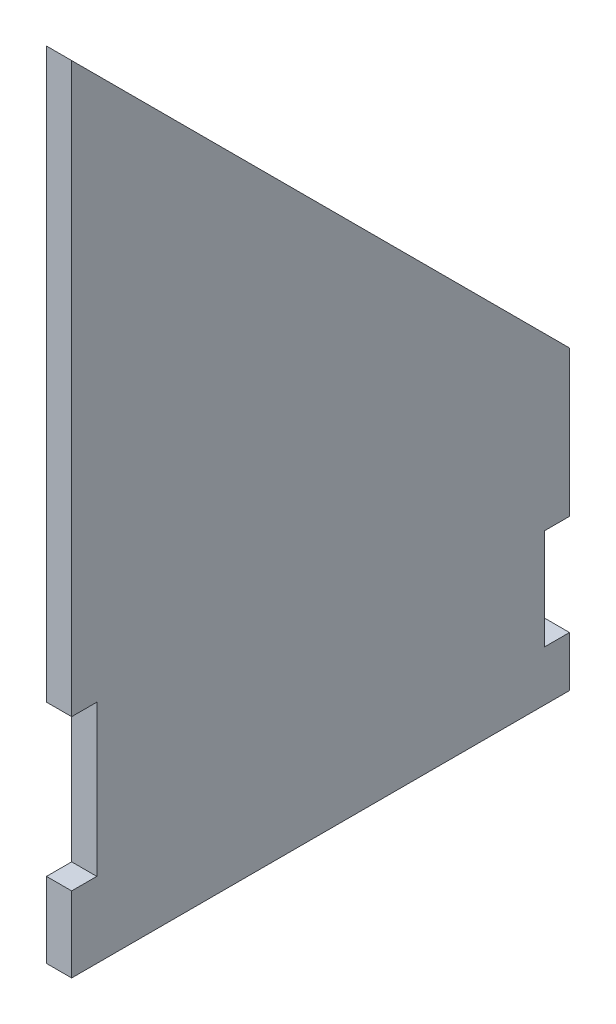
ISO-10303-21;
HEADER;
FILE_DESCRIPTION(('STEP AP214'),'2;1');
FILE_NAME('part.step','',(''),(''),'','','');
FILE_SCHEMA(('AUTOMOTIVE_DESIGN { 1 0 10303 214 1 1 1 1 }'));
ENDSEC;
DATA;
#1=APPLICATION_CONTEXT('core data for automotive mechanical design processes');
#2=APPLICATION_PROTOCOL_DEFINITION('international standard','automotive_design',2000,#1);
#3=PRODUCT_CONTEXT('',#1,'mechanical');
#4=PRODUCT('Part','Part','',(#3));
#5=PRODUCT_RELATED_PRODUCT_CATEGORY('part','',(#4));
#6=PRODUCT_DEFINITION_FORMATION('','',#4);
#7=PRODUCT_DEFINITION_CONTEXT('part definition',#1,'design');
#8=PRODUCT_DEFINITION('design','',#6,#7);
#9=PRODUCT_DEFINITION_SHAPE('','',#8);
#10=(LENGTH_UNIT() NAMED_UNIT(*) SI_UNIT(.MILLI.,.METRE.));
#11=(NAMED_UNIT(*) PLANE_ANGLE_UNIT() SI_UNIT($,.RADIAN.));
#12=(NAMED_UNIT(*) SI_UNIT($,.STERADIAN.) SOLID_ANGLE_UNIT());
#13=UNCERTAINTY_MEASURE_WITH_UNIT(LENGTH_MEASURE(1.E-05),#10,'distance_accuracy_value','');
#14=(GEOMETRIC_REPRESENTATION_CONTEXT(3) GLOBAL_UNCERTAINTY_ASSIGNED_CONTEXT((#13)) GLOBAL_UNIT_ASSIGNED_CONTEXT((#10,
#11,#12)) REPRESENTATION_CONTEXT('',''));
#15=CARTESIAN_POINT('',(0.,0.,0.));
#16=DIRECTION('',(0.,0.,1.));
#17=DIRECTION('',(1.,0.,0.));
#18=AXIS2_PLACEMENT_3D('',#15,#16,#17);
#19=CARTESIAN_POINT('',(5.,0.,-98.9949493661161));
#20=DIRECTION('',(0.,0.,1.));
#21=DIRECTION('',(0.,-1.,0.));
#22=AXIS2_PLACEMENT_3D('',#19,#20,#21);
#23=PLANE('',#22);
#24=DIRECTION('',(0.,1.,0.));
#25=VECTOR('',#24,1.);
#26=CARTESIAN_POINT('',(5.,0.,-98.9949493661161));
#27=LINE('',#26,#25);
#28=CARTESIAN_POINT('',(5.,30.,-98.9949493661161));
#29=VERTEX_POINT('',#28);
#30=CARTESIAN_POINT('',(5.,59.,-98.9949493661161));
#31=VERTEX_POINT('',#30);
#32=EDGE_CURVE('E171',#29,#31,#27,.T.);
#33=ORIENTED_EDGE('',*,*,#32,.F.);
#34=DIRECTION('',(1.,0.,0.));
#35=VECTOR('',#34,1.);
#36=CARTESIAN_POINT('',(-5.,30.,-98.9949493661161));
#37=LINE('',#36,#35);
#38=CARTESIAN_POINT('',(0.,30.,-98.9949493661161));
#39=VERTEX_POINT('',#38);
#40=EDGE_CURVE('E147',#39,#29,#37,.T.);
#41=ORIENTED_EDGE('',*,*,#40,.F.);
#42=DIRECTION('',(0.,1.,0.));
#43=VECTOR('',#42,1.);
#44=CARTESIAN_POINT('',(0.,0.,-98.9949493661161));
#45=LINE('',#44,#43);
#46=CARTESIAN_POINT('',(0.,59.,-98.9949493661161));
#47=VERTEX_POINT('',#46);
#48=EDGE_CURVE('E181',#39,#47,#45,.T.);
#49=ORIENTED_EDGE('',*,*,#48,.T.);
#50=DIRECTION('',(-1.,0.,0.));
#51=VECTOR('',#50,1.);
#52=CARTESIAN_POINT('',(5.,59.,-98.9949493661161));
#53=LINE('',#52,#51);
#54=EDGE_CURVE('E189',#31,#47,#53,.T.);
#55=ORIENTED_EDGE('',*,*,#54,.F.);
#56=EDGE_LOOP('',(#33,#41,#49,#55));
#57=FACE_BOUND('',#56,.T.);
#58=ADVANCED_FACE('F33',(#57),#23,.F.);
#59=CARTESIAN_POINT('',(5.,0.,0.));
#60=DIRECTION('',(0.,0.,-1.));
#61=DIRECTION('',(0.,1.,0.));
#62=AXIS2_PLACEMENT_3D('',#59,#60,#61);
#63=PLANE('',#62);
#64=DIRECTION('',(0.,-1.,0.));
#65=VECTOR('',#64,1.);
#66=CARTESIAN_POINT('',(5.,0.,0.));
#67=LINE('',#66,#65);
#68=CARTESIAN_POINT('',(5.,15.,0.));
#69=VERTEX_POINT('',#68);
#70=CARTESIAN_POINT('',(5.,0.,0.));
#71=VERTEX_POINT('',#70);
#72=EDGE_CURVE('E169',#69,#71,#67,.T.);
#73=ORIENTED_EDGE('',*,*,#72,.F.);
#74=DIRECTION('',(1.,0.,0.));
#75=VECTOR('',#74,1.);
#76=CARTESIAN_POINT('',(-5.,15.,0.));
#77=LINE('',#76,#75);
#78=CARTESIAN_POINT('',(0.,15.,0.));
#79=VERTEX_POINT('',#78);
#80=EDGE_CURVE('E161',#79,#69,#77,.T.);
#81=ORIENTED_EDGE('',*,*,#80,.F.);
#82=DIRECTION('',(0.,-1.,0.));
#83=VECTOR('',#82,1.);
#84=CARTESIAN_POINT('',(0.,0.,0.));
#85=LINE('',#84,#83);
#86=CARTESIAN_POINT('',(0.,0.,0.));
#87=VERTEX_POINT('',#86);
#88=EDGE_CURVE('E160',#79,#87,#85,.T.);
#89=ORIENTED_EDGE('',*,*,#88,.T.);
#90=DIRECTION('',(-1.,0.,0.));
#91=VECTOR('',#90,1.);
#92=CARTESIAN_POINT('',(5.,0.,0.));
#93=LINE('',#92,#91);
#94=EDGE_CURVE('E195',#71,#87,#93,.T.);
#95=ORIENTED_EDGE('',*,*,#94,.F.);
#96=EDGE_LOOP('',(#73,#81,#89,#95));
#97=FACE_BOUND('',#96,.T.);
#98=ADVANCED_FACE('F238',(#97),#63,.F.);
#99=CARTESIAN_POINT('',(0.,157.994949366118,0.));
#100=VERTEX_POINT('',#99);
#101=CARTESIAN_POINT('',(0.,45.,0.));
#102=VERTEX_POINT('',#101);
#103=EDGE_CURVE('E176',#100,#102,#85,.T.);
#104=ORIENTED_EDGE('',*,*,#103,.T.);
#105=DIRECTION('',(1.,0.,0.));
#106=VECTOR('',#105,1.);
#107=CARTESIAN_POINT('',(-5.,45.,0.));
#108=LINE('',#107,#106);
#109=CARTESIAN_POINT('',(5.,45.,0.));
#110=VERTEX_POINT('',#109);
#111=EDGE_CURVE('E56',#102,#110,#108,.T.);
#112=ORIENTED_EDGE('',*,*,#111,.T.);
#113=CARTESIAN_POINT('',(5.,157.994949366118,0.));
#114=VERTEX_POINT('',#113);
#115=EDGE_CURVE('E165',#114,#110,#67,.T.);
#116=ORIENTED_EDGE('',*,*,#115,.F.);
#117=DIRECTION('',(-1.,0.,0.));
#118=VECTOR('',#117,1.);
#119=CARTESIAN_POINT('',(5.,157.994949366118,0.));
#120=LINE('',#119,#118);
#121=EDGE_CURVE('E175',#114,#100,#120,.T.);
#122=ORIENTED_EDGE('',*,*,#121,.T.);
#123=EDGE_LOOP('',(#104,#112,#116,#122));
#124=FACE_BOUND('',#123,.T.);
#125=ADVANCED_FACE('F35',(#124),#63,.F.);
#126=CARTESIAN_POINT('',(5.,0.,0.));
#127=DIRECTION('',(0.,1.,0.));
#128=DIRECTION('',(0.,0.,1.));
#129=AXIS2_PLACEMENT_3D('',#126,#127,#128);
#130=PLANE('',#129);
#131=DIRECTION('',(0.,0.,-1.));
#132=VECTOR('',#131,1.);
#133=CARTESIAN_POINT('',(0.,0.,0.));
#134=LINE('',#133,#132);
#135=CARTESIAN_POINT('',(0.,0.,-98.9949493661161));
#136=VERTEX_POINT('',#135);
#137=EDGE_CURVE('E179',#87,#136,#134,.T.);
#138=ORIENTED_EDGE('',*,*,#137,.T.);
#139=DIRECTION('',(-1.,0.,0.));
#140=VECTOR('',#139,1.);
#141=CARTESIAN_POINT('',(5.,0.,-98.9949493661161));
#142=LINE('',#141,#140);
#143=CARTESIAN_POINT('',(5.,0.,-98.9949493661161));
#144=VERTEX_POINT('',#143);
#145=EDGE_CURVE('E192',#144,#136,#142,.T.);
#146=ORIENTED_EDGE('',*,*,#145,.F.);
#147=DIRECTION('',(0.,0.,-1.));
#148=VECTOR('',#147,1.);
#149=CARTESIAN_POINT('',(5.,0.,0.));
#150=LINE('',#149,#148);
#151=EDGE_CURVE('E168',#71,#144,#150,.T.);
#152=ORIENTED_EDGE('',*,*,#151,.F.);
#153=ORIENTED_EDGE('',*,*,#94,.T.);
#154=EDGE_LOOP('',(#138,#146,#152,#153));
#155=FACE_BOUND('',#154,.T.);
#156=ADVANCED_FACE('F242',(#155),#130,.F.);
#157=CARTESIAN_POINT('',(0.,10.,-98.9949493661161));
#158=VERTEX_POINT('',#157);
#159=EDGE_CURVE('E182',#136,#158,#45,.T.);
#160=ORIENTED_EDGE('',*,*,#159,.T.);
#161=DIRECTION('',(1.,0.,0.));
#162=VECTOR('',#161,1.);
#163=CARTESIAN_POINT('',(-5.,10.,-98.9949493661161));
#164=LINE('',#163,#162);
#165=CARTESIAN_POINT('',(5.,10.,-98.9949493661161));
#166=VERTEX_POINT('',#165);
#167=EDGE_CURVE('E48',#158,#166,#164,.T.);
#168=ORIENTED_EDGE('',*,*,#167,.T.);
#169=EDGE_CURVE('E141',#144,#166,#27,.T.);
#170=ORIENTED_EDGE('',*,*,#169,.F.);
#171=ORIENTED_EDGE('',*,*,#145,.T.);
#172=EDGE_LOOP('',(#160,#168,#170,#171));
#173=FACE_BOUND('',#172,.T.);
#174=ADVANCED_FACE('F246',(#173),#23,.F.);
#175=CARTESIAN_POINT('',(5.,157.994949366118,0.));
#176=DIRECTION('',(0.,-0.707106781186542,0.707106781186553));
#177=DIRECTION('',(0.,-0.707106781186553,-0.707106781186542));
#178=AXIS2_PLACEMENT_3D('',#175,#176,#177);
#179=PLANE('',#178);
#180=DIRECTION('',(0.,0.707106781186553,0.707106781186542));
#181=VECTOR('',#180,1.);
#182=CARTESIAN_POINT('',(0.,157.994949366118,0.));
#183=LINE('',#182,#181);
#184=EDGE_CURVE('E185',#47,#100,#183,.T.);
#185=ORIENTED_EDGE('',*,*,#184,.T.);
#186=ORIENTED_EDGE('',*,*,#121,.F.);
#187=DIRECTION('',(0.,0.707106781186553,0.707106781186542));
#188=VECTOR('',#187,1.);
#189=CARTESIAN_POINT('',(5.,157.994949366118,0.));
#190=LINE('',#189,#188);
#191=EDGE_CURVE('E173',#31,#114,#190,.T.);
#192=ORIENTED_EDGE('',*,*,#191,.F.);
#193=ORIENTED_EDGE('',*,*,#54,.T.);
#194=EDGE_LOOP('',(#185,#186,#192,#193));
#195=FACE_BOUND('',#194,.T.);
#196=ADVANCED_FACE('F218',(#195),#179,.F.);
#197=CARTESIAN_POINT('',(5.,0.,0.));
#198=DIRECTION('',(-1.,0.,0.));
#199=DIRECTION('',(0.,0.,1.));
#200=AXIS2_PLACEMENT_3D('',#197,#198,#199);
#201=PLANE('',#200);
#202=DIRECTION('',(0.,-1.,0.));
#203=VECTOR('',#202,1.);
#204=CARTESIAN_POINT('',(5.,30.,-93.9949493661161));
#205=LINE('',#204,#203);
#206=CARTESIAN_POINT('',(5.,30.,-93.9949493661161));
#207=VERTEX_POINT('',#206);
#208=CARTESIAN_POINT('',(5.,10.,-93.9949493661161));
#209=VERTEX_POINT('',#208);
#210=EDGE_CURVE('E130',#207,#209,#205,.T.);
#211=ORIENTED_EDGE('',*,*,#210,.F.);
#212=DIRECTION('',(0.,0.,1.));
#213=VECTOR('',#212,1.);
#214=CARTESIAN_POINT('',(5.,30.,-93.9949493661161));
#215=LINE('',#214,#213);
#216=EDGE_CURVE('E127',#29,#207,#215,.T.);
#217=ORIENTED_EDGE('',*,*,#216,.F.);
#218=ORIENTED_EDGE('',*,*,#32,.T.);
#219=ORIENTED_EDGE('',*,*,#191,.T.);
#220=ORIENTED_EDGE('',*,*,#115,.T.);
#221=DIRECTION('',(0.,0.,1.));
#222=VECTOR('',#221,1.);
#223=CARTESIAN_POINT('',(5.,45.,-5.00000000000001));
#224=LINE('',#223,#222);
#225=CARTESIAN_POINT('',(5.,45.,-5.00000000000001));
#226=VERTEX_POINT('',#225);
#227=EDGE_CURVE('E152',#226,#110,#224,.T.);
#228=ORIENTED_EDGE('',*,*,#227,.F.);
#229=DIRECTION('',(0.,1.,0.));
#230=VECTOR('',#229,1.);
#231=CARTESIAN_POINT('',(5.,45.,-5.00000000000001));
#232=LINE('',#231,#230);
#233=CARTESIAN_POINT('',(5.,15.,-5.00000000000001));
#234=VERTEX_POINT('',#233);
#235=EDGE_CURVE('E146',#234,#226,#232,.T.);
#236=ORIENTED_EDGE('',*,*,#235,.F.);
#237=DIRECTION('',(0.,0.,-1.));
#238=VECTOR('',#237,1.);
#239=CARTESIAN_POINT('',(5.,15.,-5.00000000000001));
#240=LINE('',#239,#238);
#241=EDGE_CURVE('E154',#69,#234,#240,.T.);
#242=ORIENTED_EDGE('',*,*,#241,.F.);
#243=ORIENTED_EDGE('',*,*,#72,.T.);
#244=ORIENTED_EDGE('',*,*,#151,.T.);
#245=ORIENTED_EDGE('',*,*,#169,.T.);
#246=DIRECTION('',(0.,0.,-1.));
#247=VECTOR('',#246,1.);
#248=CARTESIAN_POINT('',(5.,10.,-93.9949493661161));
#249=LINE('',#248,#247);
#250=EDGE_CURVE('E123',#209,#166,#249,.T.);
#251=ORIENTED_EDGE('',*,*,#250,.F.);
#252=EDGE_LOOP('',(#211,#217,#218,#219,#220,#228,#236,#242,#243,#244,#245,#251));
#253=FACE_BOUND('',#252,.T.);
#254=ADVANCED_FACE('F139',(#253),#201,.F.);
#255=CARTESIAN_POINT('',(0.,0.,0.));
#256=DIRECTION('',(-1.,0.,0.));
#257=DIRECTION('',(0.,0.,1.));
#258=AXIS2_PLACEMENT_3D('',#255,#256,#257);
#259=PLANE('',#258);
#260=DIRECTION('',(0.,0.,-1.));
#261=VECTOR('',#260,1.);
#262=CARTESIAN_POINT('',(0.,30.,0.));
#263=LINE('',#262,#261);
#264=CARTESIAN_POINT('',(0.,30.,-93.9949493661161));
#265=VERTEX_POINT('',#264);
#266=EDGE_CURVE('E11',#265,#39,#263,.T.);
#267=ORIENTED_EDGE('',*,*,#266,.F.);
#268=DIRECTION('',(0.,1.,0.));
#269=VECTOR('',#268,1.);
#270=CARTESIAN_POINT('',(0.,0.,-93.9949493661161));
#271=LINE('',#270,#269);
#272=CARTESIAN_POINT('',(0.,10.,-93.9949493661161));
#273=VERTEX_POINT('',#272);
#274=EDGE_CURVE('E41',#273,#265,#271,.T.);
#275=ORIENTED_EDGE('',*,*,#274,.F.);
#276=DIRECTION('',(0.,0.,1.));
#277=VECTOR('',#276,1.);
#278=CARTESIAN_POINT('',(0.,10.,0.));
#279=LINE('',#278,#277);
#280=EDGE_CURVE('E124',#158,#273,#279,.T.);
#281=ORIENTED_EDGE('',*,*,#280,.F.);
#282=ORIENTED_EDGE('',*,*,#159,.F.);
#283=ORIENTED_EDGE('',*,*,#137,.F.);
#284=ORIENTED_EDGE('',*,*,#88,.F.);
#285=DIRECTION('',(0.,0.,1.));
#286=VECTOR('',#285,1.);
#287=CARTESIAN_POINT('',(0.,15.,0.));
#288=LINE('',#287,#286);
#289=CARTESIAN_POINT('',(0.,15.,-5.00000000000001));
#290=VERTEX_POINT('',#289);
#291=EDGE_CURVE('E202',#290,#79,#288,.T.);
#292=ORIENTED_EDGE('',*,*,#291,.F.);
#293=DIRECTION('',(0.,-1.,0.));
#294=VECTOR('',#293,1.);
#295=CARTESIAN_POINT('',(0.,0.,-5.00000000000001));
#296=LINE('',#295,#294);
#297=CARTESIAN_POINT('',(0.,45.,-5.00000000000001));
#298=VERTEX_POINT('',#297);
#299=EDGE_CURVE('E200',#298,#290,#296,.T.);
#300=ORIENTED_EDGE('',*,*,#299,.F.);
#301=DIRECTION('',(0.,0.,-1.));
#302=VECTOR('',#301,1.);
#303=CARTESIAN_POINT('',(0.,45.,0.));
#304=LINE('',#303,#302);
#305=EDGE_CURVE('E198',#102,#298,#304,.T.);
#306=ORIENTED_EDGE('',*,*,#305,.F.);
#307=ORIENTED_EDGE('',*,*,#103,.F.);
#308=ORIENTED_EDGE('',*,*,#184,.F.);
#309=ORIENTED_EDGE('',*,*,#48,.F.);
#310=EDGE_LOOP('',(#267,#275,#281,#282,#283,#284,#292,#300,#306,#307,#308,#309));
#311=FACE_BOUND('',#310,.T.);
#312=ADVANCED_FACE('F210',(#311),#259,.T.);
#313=CARTESIAN_POINT('',(-5.,45.,-5.00000000000001));
#314=DIRECTION('',(0.,0.,-1.));
#315=DIRECTION('',(0.,1.,0.));
#316=AXIS2_PLACEMENT_3D('',#313,#314,#315);
#317=PLANE('',#316);
#318=ORIENTED_EDGE('',*,*,#299,.T.);
#319=DIRECTION('',(1.,0.,0.));
#320=VECTOR('',#319,1.);
#321=CARTESIAN_POINT('',(-5.,15.,-5.00000000000001));
#322=LINE('',#321,#320);
#323=EDGE_CURVE('E158',#290,#234,#322,.T.);
#324=ORIENTED_EDGE('',*,*,#323,.T.);
#325=ORIENTED_EDGE('',*,*,#235,.T.);
#326=DIRECTION('',(1.,0.,0.));
#327=VECTOR('',#326,1.);
#328=CARTESIAN_POINT('',(-5.,45.,-5.00000000000001));
#329=LINE('',#328,#327);
#330=EDGE_CURVE('E157',#298,#226,#329,.T.);
#331=ORIENTED_EDGE('',*,*,#330,.F.);
#332=EDGE_LOOP('',(#318,#324,#325,#331));
#333=FACE_BOUND('',#332,.T.);
#334=ADVANCED_FACE('F229',(#333),#317,.F.);
#335=CARTESIAN_POINT('',(-5.,15.,-5.00000000000001));
#336=DIRECTION('',(0.,-1.,0.));
#337=DIRECTION('',(0.,0.,-1.));
#338=AXIS2_PLACEMENT_3D('',#335,#336,#337);
#339=PLANE('',#338);
#340=ORIENTED_EDGE('',*,*,#291,.T.);
#341=ORIENTED_EDGE('',*,*,#80,.T.);
#342=ORIENTED_EDGE('',*,*,#241,.T.);
#343=ORIENTED_EDGE('',*,*,#323,.F.);
#344=EDGE_LOOP('',(#340,#341,#342,#343));
#345=FACE_BOUND('',#344,.T.);
#346=ADVANCED_FACE('F247',(#345),#339,.F.);
#347=CARTESIAN_POINT('',(-5.,45.,-5.00000000000001));
#348=DIRECTION('',(0.,1.,0.));
#349=DIRECTION('',(0.,0.,1.));
#350=AXIS2_PLACEMENT_3D('',#347,#348,#349);
#351=PLANE('',#350);
#352=ORIENTED_EDGE('',*,*,#305,.T.);
#353=ORIENTED_EDGE('',*,*,#330,.T.);
#354=ORIENTED_EDGE('',*,*,#227,.T.);
#355=ORIENTED_EDGE('',*,*,#111,.F.);
#356=EDGE_LOOP('',(#352,#353,#354,#355));
#357=FACE_BOUND('',#356,.T.);
#358=ADVANCED_FACE('F227',(#357),#351,.F.);
#359=CARTESIAN_POINT('',(-5.,30.,-93.9949493661161));
#360=DIRECTION('',(0.,0.,1.));
#361=DIRECTION('',(1.,0.,0.));
#362=AXIS2_PLACEMENT_3D('',#359,#360,#361);
#363=PLANE('',#362);
#364=ORIENTED_EDGE('',*,*,#274,.T.);
#365=DIRECTION('',(1.,0.,0.));
#366=VECTOR('',#365,1.);
#367=CARTESIAN_POINT('',(-5.,30.,-93.9949493661161));
#368=LINE('',#367,#366);
#369=EDGE_CURVE('E133',#265,#207,#368,.T.);
#370=ORIENTED_EDGE('',*,*,#369,.T.);
#371=ORIENTED_EDGE('',*,*,#210,.T.);
#372=DIRECTION('',(1.,0.,0.));
#373=VECTOR('',#372,1.);
#374=CARTESIAN_POINT('',(-5.,10.,-93.9949493661161));
#375=LINE('',#374,#373);
#376=EDGE_CURVE('E119',#273,#209,#375,.T.);
#377=ORIENTED_EDGE('',*,*,#376,.F.);
#378=EDGE_LOOP('',(#364,#370,#371,#377));
#379=FACE_BOUND('',#378,.T.);
#380=ADVANCED_FACE('F131',(#379),#363,.F.);
#381=CARTESIAN_POINT('',(-5.,30.,-93.9949493661161));
#382=DIRECTION('',(0.,1.,0.));
#383=DIRECTION('',(0.,0.,1.));
#384=AXIS2_PLACEMENT_3D('',#381,#382,#383);
#385=PLANE('',#384);
#386=ORIENTED_EDGE('',*,*,#266,.T.);
#387=ORIENTED_EDGE('',*,*,#40,.T.);
#388=ORIENTED_EDGE('',*,*,#216,.T.);
#389=ORIENTED_EDGE('',*,*,#369,.F.);
#390=EDGE_LOOP('',(#386,#387,#388,#389));
#391=FACE_BOUND('',#390,.T.);
#392=ADVANCED_FACE('F207',(#391),#385,.F.);
#393=CARTESIAN_POINT('',(-5.,10.,-93.9949493661161));
#394=DIRECTION('',(0.,-1.,0.));
#395=DIRECTION('',(0.,0.,-1.));
#396=AXIS2_PLACEMENT_3D('',#393,#394,#395);
#397=PLANE('',#396);
#398=ORIENTED_EDGE('',*,*,#280,.T.);
#399=ORIENTED_EDGE('',*,*,#376,.T.);
#400=ORIENTED_EDGE('',*,*,#250,.T.);
#401=ORIENTED_EDGE('',*,*,#167,.F.);
#402=EDGE_LOOP('',(#398,#399,#400,#401));
#403=FACE_BOUND('',#402,.T.);
#404=ADVANCED_FACE('F121',(#403),#397,.F.);
#405=CLOSED_SHELL('',(#58,#98,#125,#156,#174,#196,#254,#312,#334,#346,#358,#380,#392,#404));
#406=MANIFOLD_SOLID_BREP('B2',#405);
#407=ADVANCED_BREP_SHAPE_REPRESENTATION('',(#18,#406),#14);
#408=SHAPE_DEFINITION_REPRESENTATION(#9,#407);
ENDSEC;
END-ISO-10303-21;
